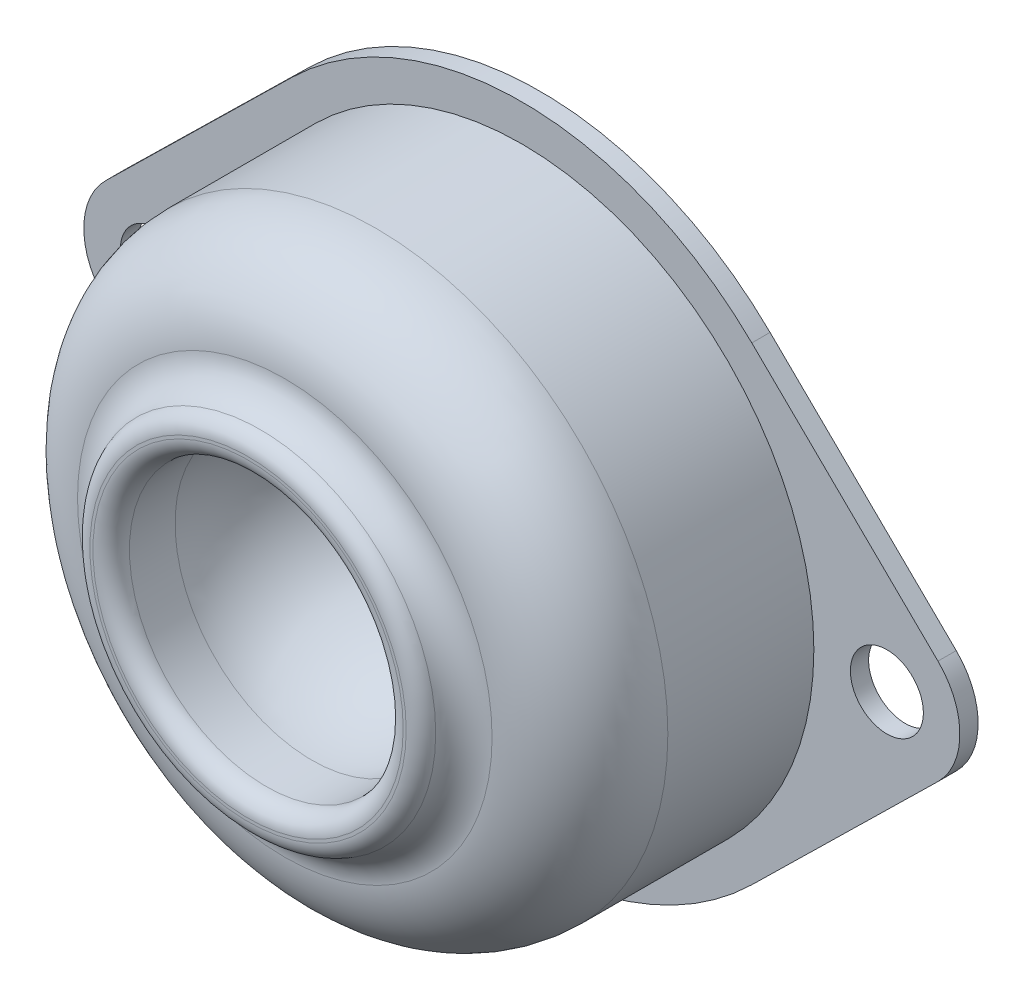
ISO-10303-21;
HEADER;
FILE_DESCRIPTION(('STEP AP214'),'2;1');
FILE_NAME('part.step','',(''),(''),'','','');
FILE_SCHEMA(('AUTOMOTIVE_DESIGN { 1 0 10303 214 1 1 1 1 }'));
ENDSEC;
DATA;
#1=APPLICATION_CONTEXT('core data for automotive mechanical design processes');
#2=APPLICATION_PROTOCOL_DEFINITION('international standard','automotive_design',2000,#1);
#3=PRODUCT_CONTEXT('',#1,'mechanical');
#4=PRODUCT('Part','Part','',(#3));
#5=PRODUCT_RELATED_PRODUCT_CATEGORY('part','',(#4));
#6=PRODUCT_DEFINITION_FORMATION('','',#4);
#7=PRODUCT_DEFINITION_CONTEXT('part definition',#1,'design');
#8=PRODUCT_DEFINITION('design','',#6,#7);
#9=PRODUCT_DEFINITION_SHAPE('','',#8);
#10=(LENGTH_UNIT() NAMED_UNIT(*) SI_UNIT(.MILLI.,.METRE.));
#11=(NAMED_UNIT(*) PLANE_ANGLE_UNIT() SI_UNIT($,.RADIAN.));
#12=(NAMED_UNIT(*) SI_UNIT($,.STERADIAN.) SOLID_ANGLE_UNIT());
#13=UNCERTAINTY_MEASURE_WITH_UNIT(LENGTH_MEASURE(1.E-05),#10,'distance_accuracy_value','');
#14=(GEOMETRIC_REPRESENTATION_CONTEXT(3) GLOBAL_UNCERTAINTY_ASSIGNED_CONTEXT((#13)) GLOBAL_UNIT_ASSIGNED_CONTEXT((#10,
#11,#12)) REPRESENTATION_CONTEXT('',''));
#15=CARTESIAN_POINT('',(0.,0.,0.));
#16=DIRECTION('',(0.,0.,1.));
#17=DIRECTION('',(1.,0.,0.));
#18=AXIS2_PLACEMENT_3D('',#15,#16,#17);
#19=CARTESIAN_POINT('',(12.6,12.8545711713771,1.));
#20=DIRECTION('',(0.7,0.714142842854285,0.));
#21=DIRECTION('',(-0.714142842854285,0.7,0.));
#22=AXIS2_PLACEMENT_3D('',#19,#20,#21);
#23=PLANE('',#22);
#24=DIRECTION('',(0.714142842854285,-0.7,0.));
#25=VECTOR('',#24,1.);
#26=CARTESIAN_POINT('',(12.6,12.8545711713771,0.));
#27=LINE('',#26,#25);
#28=CARTESIAN_POINT('',(12.6,12.8545711713771,0.));
#29=VERTEX_POINT('',#28);
#30=CARTESIAN_POINT('',(22.8,2.85657137141714,0.));
#31=VERTEX_POINT('',#30);
#32=EDGE_CURVE('E259',#29,#31,#27,.T.);
#33=ORIENTED_EDGE('',*,*,#32,.F.);
#34=DIRECTION('',(0.,0.,-1.));
#35=VECTOR('',#34,1.);
#36=CARTESIAN_POINT('',(12.6,12.8545711713771,1.));
#37=LINE('',#36,#35);
#38=CARTESIAN_POINT('',(12.6,12.8545711713771,1.));
#39=VERTEX_POINT('',#38);
#40=EDGE_CURVE('E93',#39,#29,#37,.T.);
#41=ORIENTED_EDGE('',*,*,#40,.F.);
#42=DIRECTION('',(0.714142842854285,-0.7,0.));
#43=VECTOR('',#42,1.);
#44=CARTESIAN_POINT('',(12.6,12.8545711713771,1.));
#45=LINE('',#44,#43);
#46=CARTESIAN_POINT('',(22.8,2.85657137141714,1.));
#47=VERTEX_POINT('',#46);
#48=EDGE_CURVE('E280',#39,#47,#45,.T.);
#49=ORIENTED_EDGE('',*,*,#48,.T.);
#50=DIRECTION('',(0.,0.,-1.));
#51=VECTOR('',#50,1.);
#52=CARTESIAN_POINT('',(22.8,2.85657137141714,1.));
#53=LINE('',#52,#51);
#54=EDGE_CURVE('E89',#47,#31,#53,.T.);
#55=ORIENTED_EDGE('',*,*,#54,.T.);
#56=EDGE_LOOP('',(#33,#41,#49,#55));
#57=FACE_BOUND('',#56,.T.);
#58=ADVANCED_FACE('F37',(#57),#23,.T.);
#59=CARTESIAN_POINT('',(0.,0.,1.));
#60=DIRECTION('',(0.,0.,-1.));
#61=DIRECTION('',(-1.,0.,0.));
#62=AXIS2_PLACEMENT_3D('',#59,#60,#61);
#63=CYLINDRICAL_SURFACE('',#62,18.);
#64=CARTESIAN_POINT('',(0.,0.,0.));
#65=DIRECTION('',(0.,0.,1.));
#66=DIRECTION('',(1.,0.,0.));
#67=AXIS2_PLACEMENT_3D('',#64,#65,#66);
#68=CIRCLE('',#67,18.);
#69=CARTESIAN_POINT('',(-12.6,12.8545711713771,0.));
#70=VERTEX_POINT('',#69);
#71=EDGE_CURVE('E254',#29,#70,#68,.T.);
#72=ORIENTED_EDGE('',*,*,#71,.T.);
#73=DIRECTION('',(0.,0.,-1.));
#74=VECTOR('',#73,1.);
#75=CARTESIAN_POINT('',(-12.6,12.8545711713771,1.));
#76=LINE('',#75,#74);
#77=CARTESIAN_POINT('',(-12.6,12.8545711713771,1.));
#78=VERTEX_POINT('',#77);
#79=EDGE_CURVE('E141',#78,#70,#76,.T.);
#80=ORIENTED_EDGE('',*,*,#79,.F.);
#81=CARTESIAN_POINT('',(0.,0.,1.));
#82=DIRECTION('',(0.,0.,1.));
#83=DIRECTION('',(1.,0.,0.));
#84=AXIS2_PLACEMENT_3D('',#81,#82,#83);
#85=CIRCLE('',#84,18.);
#86=EDGE_CURVE('E277',#39,#78,#85,.T.);
#87=ORIENTED_EDGE('',*,*,#86,.F.);
#88=ORIENTED_EDGE('',*,*,#40,.T.);
#89=EDGE_LOOP('',(#72,#80,#87,#88));
#90=FACE_BOUND('',#89,.T.);
#91=ADVANCED_FACE('F174',(#90),#63,.T.);
#92=CARTESIAN_POINT('',(-12.6,12.8545711713771,1.));
#93=DIRECTION('',(-0.7,0.714142842854285,0.));
#94=DIRECTION('',(-0.714142842854285,-0.7,0.));
#95=AXIS2_PLACEMENT_3D('',#92,#93,#94);
#96=PLANE('',#95);
#97=DIRECTION('',(0.714142842854285,0.7,0.));
#98=VECTOR('',#97,1.);
#99=CARTESIAN_POINT('',(-12.6,12.8545711713771,0.));
#100=LINE('',#99,#98);
#101=CARTESIAN_POINT('',(-22.8,2.85657137141714,0.));
#102=VERTEX_POINT('',#101);
#103=EDGE_CURVE('E246',#102,#70,#100,.T.);
#104=ORIENTED_EDGE('',*,*,#103,.F.);
#105=DIRECTION('',(0.,0.,-1.));
#106=VECTOR('',#105,1.);
#107=CARTESIAN_POINT('',(-22.8,2.85657137141714,1.));
#108=LINE('',#107,#106);
#109=CARTESIAN_POINT('',(-22.8,2.85657137141714,1.));
#110=VERTEX_POINT('',#109);
#111=EDGE_CURVE('E139',#110,#102,#108,.T.);
#112=ORIENTED_EDGE('',*,*,#111,.F.);
#113=DIRECTION('',(0.714142842854285,0.7,0.));
#114=VECTOR('',#113,1.);
#115=CARTESIAN_POINT('',(-12.6,12.8545711713771,1.));
#116=LINE('',#115,#114);
#117=EDGE_CURVE('E279',#110,#78,#116,.T.);
#118=ORIENTED_EDGE('',*,*,#117,.T.);
#119=ORIENTED_EDGE('',*,*,#79,.T.);
#120=EDGE_LOOP('',(#104,#112,#118,#119));
#121=FACE_BOUND('',#120,.T.);
#122=ADVANCED_FACE('F179',(#121),#96,.T.);
#123=CARTESIAN_POINT('',(-20.,0.,1.));
#124=DIRECTION('',(0.,0.,-1.));
#125=DIRECTION('',(-1.,0.,0.));
#126=AXIS2_PLACEMENT_3D('',#123,#124,#125);
#127=CYLINDRICAL_SURFACE('',#126,4.);
#128=CARTESIAN_POINT('',(-20.,0.,0.));
#129=DIRECTION('',(0.,0.,1.));
#130=DIRECTION('',(1.,0.,0.));
#131=AXIS2_PLACEMENT_3D('',#128,#129,#130);
#132=CIRCLE('',#131,4.);
#133=CARTESIAN_POINT('',(-22.8,-2.85657137141714,0.));
#134=VERTEX_POINT('',#133);
#135=EDGE_CURVE('E253',#102,#134,#132,.T.);
#136=ORIENTED_EDGE('',*,*,#135,.T.);
#137=DIRECTION('',(0.,0.,-1.));
#138=VECTOR('',#137,1.);
#139=CARTESIAN_POINT('',(-22.8,-2.85657137141714,1.));
#140=LINE('',#139,#138);
#141=CARTESIAN_POINT('',(-22.8,-2.85657137141714,1.));
#142=VERTEX_POINT('',#141);
#143=EDGE_CURVE('E132',#142,#134,#140,.T.);
#144=ORIENTED_EDGE('',*,*,#143,.F.);
#145=CARTESIAN_POINT('',(-20.,0.,1.));
#146=DIRECTION('',(0.,0.,1.));
#147=DIRECTION('',(1.,0.,0.));
#148=AXIS2_PLACEMENT_3D('',#145,#146,#147);
#149=CIRCLE('',#148,4.);
#150=EDGE_CURVE('E289',#110,#142,#149,.T.);
#151=ORIENTED_EDGE('',*,*,#150,.F.);
#152=ORIENTED_EDGE('',*,*,#111,.T.);
#153=EDGE_LOOP('',(#136,#144,#151,#152));
#154=FACE_BOUND('',#153,.T.);
#155=ADVANCED_FACE('F236',(#154),#127,.T.);
#156=CARTESIAN_POINT('',(-12.6,-12.8545711713771,1.));
#157=DIRECTION('',(0.7,0.714142842854285,0.));
#158=DIRECTION('',(-0.714142842854285,0.7,0.));
#159=AXIS2_PLACEMENT_3D('',#156,#157,#158);
#160=PLANE('',#159);
#161=DIRECTION('',(0.714142842854285,-0.7,0.));
#162=VECTOR('',#161,1.);
#163=CARTESIAN_POINT('',(-12.6,-12.8545711713771,0.));
#164=LINE('',#163,#162);
#165=CARTESIAN_POINT('',(-12.6,-12.8545711713771,0.));
#166=VERTEX_POINT('',#165);
#167=EDGE_CURVE('E257',#134,#166,#164,.T.);
#168=ORIENTED_EDGE('',*,*,#167,.T.);
#169=DIRECTION('',(0.,0.,-1.));
#170=VECTOR('',#169,1.);
#171=CARTESIAN_POINT('',(-12.6,-12.8545711713771,1.));
#172=LINE('',#171,#170);
#173=CARTESIAN_POINT('',(-12.6,-12.8545711713771,1.));
#174=VERTEX_POINT('',#173);
#175=EDGE_CURVE('E130',#174,#166,#172,.T.);
#176=ORIENTED_EDGE('',*,*,#175,.F.);
#177=DIRECTION('',(0.714142842854285,-0.7,0.));
#178=VECTOR('',#177,1.);
#179=CARTESIAN_POINT('',(-12.6,-12.8545711713771,1.));
#180=LINE('',#179,#178);
#181=EDGE_CURVE('E123',#142,#174,#180,.T.);
#182=ORIENTED_EDGE('',*,*,#181,.F.);
#183=ORIENTED_EDGE('',*,*,#143,.T.);
#184=EDGE_LOOP('',(#168,#176,#182,#183));
#185=FACE_BOUND('',#184,.T.);
#186=ADVANCED_FACE('F233',(#185),#160,.F.);
#187=CARTESIAN_POINT('',(0.,0.,1.));
#188=DIRECTION('',(0.,0.,-1.));
#189=DIRECTION('',(-1.,0.,0.));
#190=AXIS2_PLACEMENT_3D('',#187,#188,#189);
#191=CYLINDRICAL_SURFACE('',#190,18.);
#192=CARTESIAN_POINT('',(0.,0.,0.));
#193=DIRECTION('',(0.,0.,1.));
#194=DIRECTION('',(1.,0.,0.));
#195=AXIS2_PLACEMENT_3D('',#192,#193,#194);
#196=CIRCLE('',#195,18.);
#197=CARTESIAN_POINT('',(12.6,-12.8545711713771,0.));
#198=VERTEX_POINT('',#197);
#199=EDGE_CURVE('E129',#166,#198,#196,.T.);
#200=ORIENTED_EDGE('',*,*,#199,.T.);
#201=DIRECTION('',(0.,0.,-1.));
#202=VECTOR('',#201,1.);
#203=CARTESIAN_POINT('',(12.6,-12.8545711713771,1.));
#204=LINE('',#203,#202);
#205=CARTESIAN_POINT('',(12.6,-12.8545711713771,1.));
#206=VERTEX_POINT('',#205);
#207=EDGE_CURVE('E115',#206,#198,#204,.T.);
#208=ORIENTED_EDGE('',*,*,#207,.F.);
#209=CARTESIAN_POINT('',(0.,0.,1.));
#210=DIRECTION('',(0.,0.,1.));
#211=DIRECTION('',(1.,0.,0.));
#212=AXIS2_PLACEMENT_3D('',#209,#210,#211);
#213=CIRCLE('',#212,18.);
#214=EDGE_CURVE('E118',#174,#206,#213,.T.);
#215=ORIENTED_EDGE('',*,*,#214,.F.);
#216=ORIENTED_EDGE('',*,*,#175,.T.);
#217=EDGE_LOOP('',(#200,#208,#215,#216));
#218=FACE_BOUND('',#217,.T.);
#219=ADVANCED_FACE('F128',(#218),#191,.T.);
#220=CARTESIAN_POINT('',(12.6,-12.8545711713771,1.));
#221=DIRECTION('',(-0.7,0.714142842854285,0.));
#222=DIRECTION('',(-0.714142842854285,-0.7,0.));
#223=AXIS2_PLACEMENT_3D('',#220,#221,#222);
#224=PLANE('',#223);
#225=DIRECTION('',(0.714142842854285,0.7,0.));
#226=VECTOR('',#225,1.);
#227=CARTESIAN_POINT('',(12.6,-12.8545711713771,0.));
#228=LINE('',#227,#226);
#229=CARTESIAN_POINT('',(22.8,-2.85657137141714,0.));
#230=VERTEX_POINT('',#229);
#231=EDGE_CURVE('E266',#198,#230,#228,.T.);
#232=ORIENTED_EDGE('',*,*,#231,.T.);
#233=DIRECTION('',(0.,0.,-1.));
#234=VECTOR('',#233,1.);
#235=CARTESIAN_POINT('',(22.8,-2.85657137141714,1.));
#236=LINE('',#235,#234);
#237=CARTESIAN_POINT('',(22.8,-2.85657137141714,1.));
#238=VERTEX_POINT('',#237);
#239=EDGE_CURVE('E117',#238,#230,#236,.T.);
#240=ORIENTED_EDGE('',*,*,#239,.F.);
#241=DIRECTION('',(0.714142842854285,0.7,0.));
#242=VECTOR('',#241,1.);
#243=CARTESIAN_POINT('',(12.6,-12.8545711713771,1.));
#244=LINE('',#243,#242);
#245=EDGE_CURVE('E110',#206,#238,#244,.T.);
#246=ORIENTED_EDGE('',*,*,#245,.F.);
#247=ORIENTED_EDGE('',*,*,#207,.T.);
#248=EDGE_LOOP('',(#232,#240,#246,#247));
#249=FACE_BOUND('',#248,.T.);
#250=ADVANCED_FACE('F113',(#249),#224,.F.);
#251=CARTESIAN_POINT('',(20.,0.,1.));
#252=DIRECTION('',(0.,0.,-1.));
#253=DIRECTION('',(-1.,0.,0.));
#254=AXIS2_PLACEMENT_3D('',#251,#252,#253);
#255=CYLINDRICAL_SURFACE('',#254,2.);
#256=CARTESIAN_POINT('',(20.,0.,1.));
#257=DIRECTION('',(0.,0.,1.));
#258=DIRECTION('',(1.,0.,0.));
#259=AXIS2_PLACEMENT_3D('',#256,#257,#258);
#260=CIRCLE('',#259,2.);
#261=CARTESIAN_POINT('',(22.,0.,1.));
#262=VERTEX_POINT('',#261);
#263=EDGE_CURVE('E282',#262,#262,#260,.T.);
#264=ORIENTED_EDGE('',*,*,#263,.T.);
#265=EDGE_LOOP('',(#264));
#266=FACE_BOUND('',#265,.T.);
#267=CARTESIAN_POINT('',(20.,0.,0.));
#268=DIRECTION('',(0.,0.,1.));
#269=DIRECTION('',(1.,0.,0.));
#270=AXIS2_PLACEMENT_3D('',#267,#268,#269);
#271=CIRCLE('',#270,2.);
#272=CARTESIAN_POINT('',(22.,0.,0.));
#273=VERTEX_POINT('',#272);
#274=EDGE_CURVE('E274',#273,#273,#271,.T.);
#275=ORIENTED_EDGE('',*,*,#274,.F.);
#276=EDGE_LOOP('',(#275));
#277=FACE_BOUND('',#276,.T.);
#278=ADVANCED_FACE('F184',(#266,#277),#255,.F.);
#279=CARTESIAN_POINT('',(-20.,0.,1.));
#280=DIRECTION('',(0.,0.,-1.));
#281=DIRECTION('',(-1.,0.,0.));
#282=AXIS2_PLACEMENT_3D('',#279,#280,#281);
#283=CYLINDRICAL_SURFACE('',#282,2.);
#284=CARTESIAN_POINT('',(-20.,0.,1.));
#285=DIRECTION('',(0.,0.,1.));
#286=DIRECTION('',(1.,0.,0.));
#287=AXIS2_PLACEMENT_3D('',#284,#285,#286);
#288=CIRCLE('',#287,2.);
#289=CARTESIAN_POINT('',(-18.,0.,1.));
#290=VERTEX_POINT('',#289);
#291=EDGE_CURVE('E268',#290,#290,#288,.T.);
#292=ORIENTED_EDGE('',*,*,#291,.T.);
#293=EDGE_LOOP('',(#292));
#294=FACE_BOUND('',#293,.T.);
#295=CARTESIAN_POINT('',(-20.,0.,0.));
#296=DIRECTION('',(0.,0.,1.));
#297=DIRECTION('',(1.,0.,0.));
#298=AXIS2_PLACEMENT_3D('',#295,#296,#297);
#299=CIRCLE('',#298,2.);
#300=CARTESIAN_POINT('',(-18.,0.,0.));
#301=VERTEX_POINT('',#300);
#302=EDGE_CURVE('E271',#301,#301,#299,.T.);
#303=ORIENTED_EDGE('',*,*,#302,.F.);
#304=EDGE_LOOP('',(#303));
#305=FACE_BOUND('',#304,.T.);
#306=ADVANCED_FACE('F187',(#294,#305),#283,.F.);
#307=CARTESIAN_POINT('',(20.,0.,1.));
#308=DIRECTION('',(0.,0.,-1.));
#309=DIRECTION('',(-1.,0.,0.));
#310=AXIS2_PLACEMENT_3D('',#307,#308,#309);
#311=CYLINDRICAL_SURFACE('',#310,4.);
#312=CARTESIAN_POINT('',(20.,0.,0.));
#313=DIRECTION('',(0.,0.,1.));
#314=DIRECTION('',(1.,0.,0.));
#315=AXIS2_PLACEMENT_3D('',#312,#313,#314);
#316=CIRCLE('',#315,4.);
#317=EDGE_CURVE('E82',#230,#31,#316,.T.);
#318=ORIENTED_EDGE('',*,*,#317,.T.);
#319=ORIENTED_EDGE('',*,*,#54,.F.);
#320=CARTESIAN_POINT('',(20.,0.,1.));
#321=DIRECTION('',(0.,0.,1.));
#322=DIRECTION('',(1.,0.,0.));
#323=AXIS2_PLACEMENT_3D('',#320,#321,#322);
#324=CIRCLE('',#323,4.);
#325=EDGE_CURVE('E54',#238,#47,#324,.T.);
#326=ORIENTED_EDGE('',*,*,#325,.F.);
#327=ORIENTED_EDGE('',*,*,#239,.T.);
#328=EDGE_LOOP('',(#318,#319,#326,#327));
#329=FACE_BOUND('',#328,.T.);
#330=ADVANCED_FACE('F191',(#329),#311,.T.);
#331=CARTESIAN_POINT('',(0.,0.,1.));
#332=DIRECTION('',(0.,0.,1.));
#333=DIRECTION('',(1.,0.,0.));
#334=AXIS2_PLACEMENT_3D('',#331,#332,#333);
#335=PLANE('',#334);
#336=CARTESIAN_POINT('',(0.,0.,1.));
#337=DIRECTION('',(0.,0.,1.));
#338=DIRECTION('',(1.,0.,0.));
#339=AXIS2_PLACEMENT_3D('',#336,#337,#338);
#340=CIRCLE('',#339,16.);
#341=CARTESIAN_POINT('',(-16.,0.,0.999999999999999));
#342=VERTEX_POINT('',#341);
#343=EDGE_CURVE('E275',#342,#342,#340,.T.);
#344=ORIENTED_EDGE('',*,*,#343,.F.);
#345=EDGE_LOOP('',(#344));
#346=FACE_BOUND('',#345,.T.);
#347=ORIENTED_EDGE('',*,*,#291,.F.);
#348=EDGE_LOOP('',(#347));
#349=FACE_BOUND('',#348,.T.);
#350=ORIENTED_EDGE('',*,*,#263,.F.);
#351=EDGE_LOOP('',(#350));
#352=FACE_BOUND('',#351,.T.);
#353=ORIENTED_EDGE('',*,*,#48,.F.);
#354=ORIENTED_EDGE('',*,*,#86,.T.);
#355=ORIENTED_EDGE('',*,*,#117,.F.);
#356=ORIENTED_EDGE('',*,*,#150,.T.);
#357=ORIENTED_EDGE('',*,*,#181,.T.);
#358=ORIENTED_EDGE('',*,*,#214,.T.);
#359=ORIENTED_EDGE('',*,*,#245,.T.);
#360=ORIENTED_EDGE('',*,*,#325,.T.);
#361=EDGE_LOOP('',(#353,#354,#355,#356,#357,#358,#359,#360));
#362=FACE_BOUND('',#361,.T.);
#363=ADVANCED_FACE('F121',(#346,#349,#352,#362),#335,.T.);
#364=CARTESIAN_POINT('',(0.,0.,0.));
#365=DIRECTION('',(0.,0.,1.));
#366=DIRECTION('',(1.,0.,0.));
#367=AXIS2_PLACEMENT_3D('',#364,#365,#366);
#368=PLANE('',#367);
#369=ORIENTED_EDGE('',*,*,#302,.T.);
#370=EDGE_LOOP('',(#369));
#371=FACE_BOUND('',#370,.T.);
#372=ORIENTED_EDGE('',*,*,#274,.T.);
#373=EDGE_LOOP('',(#372));
#374=FACE_BOUND('',#373,.T.);
#375=ORIENTED_EDGE('',*,*,#32,.T.);
#376=ORIENTED_EDGE('',*,*,#317,.F.);
#377=ORIENTED_EDGE('',*,*,#231,.F.);
#378=ORIENTED_EDGE('',*,*,#199,.F.);
#379=ORIENTED_EDGE('',*,*,#167,.F.);
#380=ORIENTED_EDGE('',*,*,#135,.F.);
#381=ORIENTED_EDGE('',*,*,#103,.T.);
#382=ORIENTED_EDGE('',*,*,#71,.F.);
#383=EDGE_LOOP('',(#375,#376,#377,#378,#379,#380,#381,#382));
#384=FACE_BOUND('',#383,.T.);
#385=ADVANCED_FACE('F218',(#371,#374,#384),#368,.F.);
#386=CARTESIAN_POINT('',(0.,0.,14.));
#387=DIRECTION('',(0.,0.,-1.));
#388=DIRECTION('',(-1.,0.,0.));
#389=AXIS2_PLACEMENT_3D('',#386,#387,#388);
#390=CYLINDRICAL_SURFACE('',#389,16.);
#391=CARTESIAN_POINT('',(0.,0.,9.));
#392=DIRECTION('',(0.,0.,1.));
#393=DIRECTION('',(1.,0.,0.));
#394=AXIS2_PLACEMENT_3D('',#391,#392,#393);
#395=CIRCLE('',#394,16.);
#396=CARTESIAN_POINT('',(-16.,0.,9.));
#397=VERTEX_POINT('',#396);
#398=EDGE_CURVE('E144',#397,#397,#395,.F.);
#399=CARTESIAN_POINT('',(-16.,0.,9.));
#400=CARTESIAN_POINT('',(-16.,0.,8.91666666666666));
#401=CARTESIAN_POINT('',(-16.,0.,8.83333333333333));
#402=CARTESIAN_POINT('',(-16.,0.,8.66666666666666));
#403=CARTESIAN_POINT('',(-16.,0.,8.58333333333333));
#404=CARTESIAN_POINT('',(-16.,0.,8.41666666666666));
#405=CARTESIAN_POINT('',(-16.,0.,8.33333333333333));
#406=CARTESIAN_POINT('',(-16.,0.,8.16666666666666));
#407=CARTESIAN_POINT('',(-16.,0.,8.08333333333333));
#408=CARTESIAN_POINT('',(-16.,0.,7.91666666666666));
#409=CARTESIAN_POINT('',(-16.,0.,7.83333333333333));
#410=CARTESIAN_POINT('',(-16.,0.,7.66666666666666));
#411=CARTESIAN_POINT('',(-16.,0.,7.58333333333333));
#412=CARTESIAN_POINT('',(-16.,0.,7.41666666666666));
#413=CARTESIAN_POINT('',(-16.,0.,7.33333333333333));
#414=CARTESIAN_POINT('',(-16.,0.,7.16666666666666));
#415=CARTESIAN_POINT('',(-16.,0.,7.08333333333333));
#416=CARTESIAN_POINT('',(-16.,0.,6.91666666666666));
#417=CARTESIAN_POINT('',(-16.,0.,6.83333333333333));
#418=CARTESIAN_POINT('',(-16.,0.,6.66666666666666));
#419=CARTESIAN_POINT('',(-16.,0.,6.58333333333333));
#420=CARTESIAN_POINT('',(-16.,0.,6.41666666666666));
#421=CARTESIAN_POINT('',(-16.,0.,6.33333333333333));
#422=CARTESIAN_POINT('',(-16.,0.,6.16666666666667));
#423=CARTESIAN_POINT('',(-16.,0.,6.08333333333333));
#424=CARTESIAN_POINT('',(-16.,0.,5.91666666666666));
#425=CARTESIAN_POINT('',(-16.,0.,5.83333333333333));
#426=CARTESIAN_POINT('',(-16.,0.,5.66666666666666));
#427=CARTESIAN_POINT('',(-16.,0.,5.58333333333333));
#428=CARTESIAN_POINT('',(-16.,0.,5.41666666666666));
#429=CARTESIAN_POINT('',(-16.,0.,5.33333333333333));
#430=CARTESIAN_POINT('',(-16.,0.,5.16666666666667));
#431=CARTESIAN_POINT('',(-16.,0.,5.08333333333333));
#432=CARTESIAN_POINT('',(-16.,0.,4.91666666666667));
#433=CARTESIAN_POINT('',(-16.,0.,4.83333333333333));
#434=CARTESIAN_POINT('',(-16.,0.,4.66666666666667));
#435=CARTESIAN_POINT('',(-16.,0.,4.58333333333333));
#436=CARTESIAN_POINT('',(-16.,0.,4.41666666666667));
#437=CARTESIAN_POINT('',(-16.,0.,4.33333333333333));
#438=CARTESIAN_POINT('',(-16.,0.,4.16666666666667));
#439=CARTESIAN_POINT('',(-16.,0.,4.08333333333333));
#440=CARTESIAN_POINT('',(-16.,0.,3.91666666666666));
#441=CARTESIAN_POINT('',(-16.,0.,3.83333333333333));
#442=CARTESIAN_POINT('',(-16.,0.,3.66666666666666));
#443=CARTESIAN_POINT('',(-16.,0.,3.58333333333333));
#444=CARTESIAN_POINT('',(-16.,0.,3.41666666666666));
#445=CARTESIAN_POINT('',(-16.,0.,3.33333333333333));
#446=CARTESIAN_POINT('',(-16.,0.,3.16666666666666));
#447=CARTESIAN_POINT('',(-16.,0.,3.08333333333333));
#448=CARTESIAN_POINT('',(-16.,0.,2.91666666666667));
#449=CARTESIAN_POINT('',(-16.,0.,2.83333333333333));
#450=CARTESIAN_POINT('',(-16.,0.,2.66666666666667));
#451=CARTESIAN_POINT('',(-16.,0.,2.58333333333333));
#452=CARTESIAN_POINT('',(-16.,0.,2.41666666666667));
#453=CARTESIAN_POINT('',(-16.,0.,2.33333333333333));
#454=CARTESIAN_POINT('',(-16.,0.,2.16666666666667));
#455=CARTESIAN_POINT('',(-16.,0.,2.08333333333333));
#456=CARTESIAN_POINT('',(-16.,0.,1.91666666666667));
#457=CARTESIAN_POINT('',(-16.,0.,1.83333333333333));
#458=CARTESIAN_POINT('',(-16.,0.,1.66666666666667));
#459=CARTESIAN_POINT('',(-16.,0.,1.58333333333333));
#460=CARTESIAN_POINT('',(-16.,0.,1.41666666666667));
#461=CARTESIAN_POINT('',(-16.,0.,1.33333333333333));
#462=CARTESIAN_POINT('',(-16.,0.,1.16666666666667));
#463=CARTESIAN_POINT('',(-16.,0.,1.08333333333333));
#464=CARTESIAN_POINT('',(-16.,0.,0.999999999999999));
#465=B_SPLINE_CURVE_WITH_KNOTS('',3,(#399,#400,#401,#402,#403,#404,#405,#406,#407,#408,#409,
#410,#411,#412,#413,#414,#415,#416,#417,#418,#419,#420,#421,#422,#423,#424,#425,#426,#427,#428,
#429,#430,#431,#432,#433,#434,#435,#436,#437,#438,#439,#440,#441,#442,#443,#444,#445,#446,#447,
#448,#449,#450,#451,#452,#453,#454,#455,#456,#457,#458,#459,#460,#461,#462,#463,#464),
.UNSPECIFIED.,.F.,.F.,(4,2,2,2,2,2,2,2,2,2,2,2,2,2,2,2,2,2,2,2,2,2,2,2,2,2,2,2,2,2,2,2,4),(0.,
0.25,0.5,0.750000000000001,1.,1.25,1.5,1.75,2.,2.25,2.5,2.75,3.,3.25,3.5,3.75,4.,4.25,4.5,4.75,
5.,5.25,5.5,5.75,6.,6.25,6.5,6.75,7.,7.25,7.5,7.75,8.),.UNSPECIFIED.);
#466=EDGE_CURVE('BSEAM214',#397,#342,#465,.T.);
#467=ORIENTED_EDGE('',*,*,#398,.T.);
#468=ORIENTED_EDGE('',*,*,#343,.T.);
#469=ORIENTED_EDGE('',*,*,#466,.T.);
#470=ORIENTED_EDGE('',*,*,#466,.F.);
#471=EDGE_LOOP('',(#467,#469,#468,#470));
#472=FACE_BOUND('',#471,.T.);
#473=ADVANCED_FACE('F214',(#472),#390,.T.);
#474=CARTESIAN_POINT('',(0.,0.,16.));
#475=DIRECTION('',(0.,0.,1.));
#476=DIRECTION('',(1.,0.,0.));
#477=AXIS2_PLACEMENT_3D('',#474,#475,#476);
#478=PLANE('',#477);
#479=CARTESIAN_POINT('',(0.,0.,16.));
#480=DIRECTION('',(0.,0.,1.));
#481=DIRECTION('',(1.,0.,0.));
#482=AXIS2_PLACEMENT_3D('',#479,#480,#481);
#483=CIRCLE('',#482,8.5);
#484=CARTESIAN_POINT('',(8.5,0.,16.));
#485=VERTEX_POINT('',#484);
#486=EDGE_CURVE('E11',#485,#485,#483,.F.);
#487=ORIENTED_EDGE('',*,*,#486,.T.);
#488=EDGE_LOOP('',(#487));
#489=FACE_BOUND('',#488,.T.);
#490=CARTESIAN_POINT('',(0.,0.,16.));
#491=DIRECTION('',(0.,0.,1.));
#492=DIRECTION('',(1.,0.,0.));
#493=AXIS2_PLACEMENT_3D('',#490,#491,#492);
#494=CIRCLE('',#493,8.6653147859747);
#495=CARTESIAN_POINT('',(8.6653147859747,0.,16.));
#496=VERTEX_POINT('',#495);
#497=EDGE_CURVE('E153',#496,#496,#494,.T.);
#498=ORIENTED_EDGE('',*,*,#497,.T.);
#499=EDGE_LOOP('',(#498));
#500=FACE_BOUND('',#499,.T.);
#501=ADVANCED_FACE('F197',(#489,#500),#478,.T.);
#502=CARTESIAN_POINT('',(0.,0.,9.));
#503=DIRECTION('',(0.,0.,1.));
#504=DIRECTION('',(1.,0.,0.));
#505=AXIS2_PLACEMENT_3D('',#502,#503,#504);
#506=TOROIDAL_SURFACE('',#505,11.,5.);
#507=CARTESIAN_POINT('',(0.,0.,13.9872285870599));
#508=DIRECTION('',(0.,0.,-1.));
#509=DIRECTION('',(-1.,0.,0.));
#510=AXIS2_PLACEMENT_3D('',#507,#508,#509);
#511=CIRCLE('',#510,11.3571428571428);
#512=CARTESIAN_POINT('',(-11.3571428571428,0.,13.9872285870599));
#513=VERTEX_POINT('',#512);
#514=EDGE_CURVE('E147',#513,#513,#511,.T.);
#515=ORIENTED_EDGE('',*,*,#514,.T.);
#516=EDGE_LOOP('',(#515));
#517=FACE_BOUND('',#516,.T.);
#518=ORIENTED_EDGE('',*,*,#398,.F.);
#519=EDGE_LOOP('',(#518));
#520=FACE_BOUND('',#519,.T.);
#521=ADVANCED_FACE('F193',(#517,#520),#506,.T.);
#522=CARTESIAN_POINT('',(0.,0.,15.9821200218845));
#523=DIRECTION('',(0.,0.,1.));
#524=DIRECTION('',(1.,0.,0.));
#525=AXIS2_PLACEMENT_3D('',#522,#523,#524);
#526=TOROIDAL_SURFACE('',#525,11.5,2.);
#527=CARTESIAN_POINT('',(0.,0.,15.3273733406282));
#528=DIRECTION('',(0.,0.,1.));
#529=DIRECTION('',(1.,0.,0.));
#530=AXIS2_PLACEMENT_3D('',#527,#528,#529);
#531=CIRCLE('',#530,9.61020985731647);
#532=CARTESIAN_POINT('',(9.61020985731647,0.,15.3273733406282));
#533=VERTEX_POINT('',#532);
#534=EDGE_CURVE('E156',#533,#533,#531,.F.);
#535=ORIENTED_EDGE('',*,*,#534,.T.);
#536=EDGE_LOOP('',(#535));
#537=FACE_BOUND('',#536,.T.);
#538=ORIENTED_EDGE('',*,*,#514,.F.);
#539=EDGE_LOOP('',(#538));
#540=FACE_BOUND('',#539,.T.);
#541=ADVANCED_FACE('F196',(#537,#540),#526,.F.);
#542=CARTESIAN_POINT('',(0.,0.,5.));
#543=DIRECTION('',(0.,0.,1.));
#544=DIRECTION('',(1.,0.,0.));
#545=AXIS2_PLACEMENT_3D('',#542,#543,#544);
#546=CYLINDRICAL_SURFACE('',#545,7.5);
#547=CARTESIAN_POINT('',(0.,0.,15.));
#548=DIRECTION('',(0.,0.,1.));
#549=DIRECTION('',(1.,0.,0.));
#550=AXIS2_PLACEMENT_3D('',#547,#548,#549);
#551=CIRCLE('',#550,7.5);
#552=CARTESIAN_POINT('',(7.5,0.,15.));
#553=VERTEX_POINT('',#552);
#554=EDGE_CURVE('E46',#553,#553,#551,.T.);
#555=ORIENTED_EDGE('',*,*,#554,.T.);
#556=EDGE_LOOP('',(#555));
#557=FACE_BOUND('',#556,.T.);
#558=CARTESIAN_POINT('',(0.,0.,12.5));
#559=DIRECTION('',(0.,0.,1.));
#560=DIRECTION('',(1.,0.,0.));
#561=AXIS2_PLACEMENT_3D('',#558,#559,#560);
#562=CIRCLE('',#561,7.5);
#563=CARTESIAN_POINT('',(7.5,0.,12.5));
#564=VERTEX_POINT('',#563);
#565=EDGE_CURVE('E150',#564,#564,#562,.F.);
#566=ORIENTED_EDGE('',*,*,#565,.T.);
#567=EDGE_LOOP('',(#566));
#568=FACE_BOUND('',#567,.T.);
#569=ADVANCED_FACE('F161',(#557,#568),#546,.F.);
#570=CARTESIAN_POINT('',(0.,0.,12.5));
#571=DIRECTION('',(0.,0.,1.));
#572=DIRECTION('',(1.,0.,0.));
#573=AXIS2_PLACEMENT_3D('',#570,#571,#572);
#574=SPHERICAL_SURFACE('',#573,7.5);
#575=ORIENTED_EDGE('',*,*,#565,.F.);
#576=EDGE_LOOP('',(#575));
#577=FACE_BOUND('',#576,.T.);
#578=ADVANCED_FACE('F170',(#577),#574,.F.);
#579=CARTESIAN_POINT('',(0.,0.,15.));
#580=DIRECTION('',(0.,0.,-1.));
#581=DIRECTION('',(-1.,0.,0.));
#582=AXIS2_PLACEMENT_3D('',#579,#580,#581);
#583=TOROIDAL_SURFACE('',#582,8.6653147859747,1.);
#584=ORIENTED_EDGE('',*,*,#534,.F.);
#585=EDGE_LOOP('',(#584));
#586=FACE_BOUND('',#585,.T.);
#587=ORIENTED_EDGE('',*,*,#497,.F.);
#588=EDGE_LOOP('',(#587));
#589=FACE_BOUND('',#588,.T.);
#590=ADVANCED_FACE('F165',(#586,#589),#583,.T.);
#591=CARTESIAN_POINT('',(0.,0.,15.));
#592=DIRECTION('',(0.,0.,1.));
#593=DIRECTION('',(1.,0.,0.));
#594=AXIS2_PLACEMENT_3D('',#591,#592,#593);
#595=TOROIDAL_SURFACE('',#594,8.5,1.);
#596=ORIENTED_EDGE('',*,*,#486,.F.);
#597=EDGE_LOOP('',(#596));
#598=FACE_BOUND('',#597,.T.);
#599=ORIENTED_EDGE('',*,*,#554,.F.);
#600=EDGE_LOOP('',(#599));
#601=FACE_BOUND('',#600,.T.);
#602=ADVANCED_FACE('F39',(#598,#601),#595,.T.);
#603=CLOSED_SHELL('',(#58,#91,#122,#155,#186,#219,#250,#278,#306,#330,#363,#385,#473,#501,#521,
#541,#569,#578,#590,#602));
#604=MANIFOLD_SOLID_BREP('B2',#603);
#605=ADVANCED_BREP_SHAPE_REPRESENTATION('',(#18,#604),#14);
#606=SHAPE_DEFINITION_REPRESENTATION(#9,#605);
ENDSEC;
END-ISO-10303-21;
